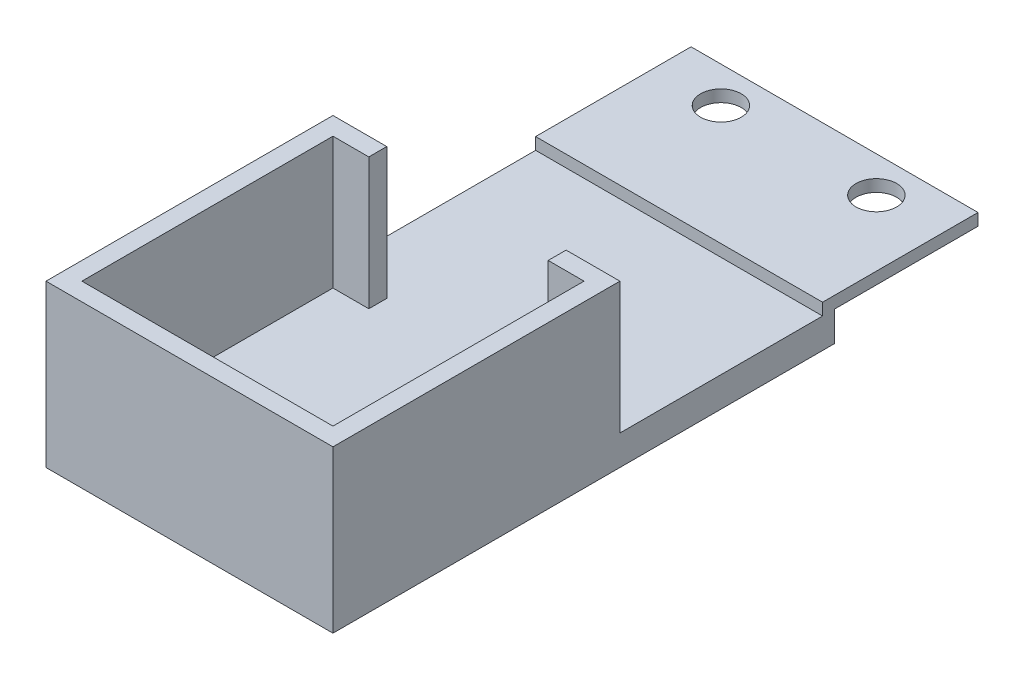
ISO-10303-21;
HEADER;
FILE_DESCRIPTION(('STEP AP214'),'2;1');
FILE_NAME('part.step','',(''),(''),'','','');
FILE_SCHEMA(('AUTOMOTIVE_DESIGN { 1 0 10303 214 1 1 1 1 }'));
ENDSEC;
DATA;
#1=APPLICATION_CONTEXT('core data for automotive mechanical design processes');
#2=APPLICATION_PROTOCOL_DEFINITION('international standard','automotive_design',2000,#1);
#3=PRODUCT_CONTEXT('',#1,'mechanical');
#4=PRODUCT('Part','Part','',(#3));
#5=PRODUCT_RELATED_PRODUCT_CATEGORY('part','',(#4));
#6=PRODUCT_DEFINITION_FORMATION('','',#4);
#7=PRODUCT_DEFINITION_CONTEXT('part definition',#1,'design');
#8=PRODUCT_DEFINITION('design','',#6,#7);
#9=PRODUCT_DEFINITION_SHAPE('','',#8);
#10=(LENGTH_UNIT() NAMED_UNIT(*) SI_UNIT(.MILLI.,.METRE.));
#11=(NAMED_UNIT(*) PLANE_ANGLE_UNIT() SI_UNIT($,.RADIAN.));
#12=(NAMED_UNIT(*) SI_UNIT($,.STERADIAN.) SOLID_ANGLE_UNIT());
#13=UNCERTAINTY_MEASURE_WITH_UNIT(LENGTH_MEASURE(1.E-05),#10,'distance_accuracy_value','');
#14=(GEOMETRIC_REPRESENTATION_CONTEXT(3) GLOBAL_UNCERTAINTY_ASSIGNED_CONTEXT((#13)) GLOBAL_UNIT_ASSIGNED_CONTEXT((#10,
#11,#12)) REPRESENTATION_CONTEXT('',''));
#15=CARTESIAN_POINT('',(0.,0.,0.));
#16=DIRECTION('',(0.,0.,1.));
#17=DIRECTION('',(1.,0.,0.));
#18=AXIS2_PLACEMENT_3D('',#15,#16,#17);
#19=CARTESIAN_POINT('',(0.,27.,35.9));
#20=DIRECTION('',(0.,0.,1.));
#21=DIRECTION('',(1.,0.,0.));
#22=AXIS2_PLACEMENT_3D('',#19,#20,#21);
#23=PLANE('',#22);
#24=DIRECTION('',(0.,1.,0.));
#25=VECTOR('',#24,1.);
#26=CARTESIAN_POINT('',(9.,27.,35.9));
#27=LINE('',#26,#25);
#28=CARTESIAN_POINT('',(9.,5.,35.9));
#29=VERTEX_POINT('',#28);
#30=CARTESIAN_POINT('',(9.,27.,35.9));
#31=VERTEX_POINT('',#30);
#32=EDGE_CURVE('E199',#29,#31,#27,.T.);
#33=ORIENTED_EDGE('',*,*,#32,.F.);
#34=DIRECTION('',(1.,0.,0.));
#35=VECTOR('',#34,1.);
#36=CARTESIAN_POINT('',(0.,5.,35.9));
#37=LINE('',#36,#35);
#38=CARTESIAN_POINT('',(0.,5.,35.9));
#39=VERTEX_POINT('',#38);
#40=EDGE_CURVE('E415',#39,#29,#37,.T.);
#41=ORIENTED_EDGE('',*,*,#40,.F.);
#42=DIRECTION('',(0.,-1.,0.));
#43=VECTOR('',#42,1.);
#44=CARTESIAN_POINT('',(0.,27.,35.9));
#45=LINE('',#44,#43);
#46=CARTESIAN_POINT('',(0.,27.,35.9));
#47=VERTEX_POINT('',#46);
#48=EDGE_CURVE('E206',#47,#39,#45,.T.);
#49=ORIENTED_EDGE('',*,*,#48,.F.);
#50=DIRECTION('',(-1.,0.,0.));
#51=VECTOR('',#50,1.);
#52=CARTESIAN_POINT('',(0.,27.,35.9));
#53=LINE('',#52,#51);
#54=EDGE_CURVE('E314',#31,#47,#53,.T.);
#55=ORIENTED_EDGE('',*,*,#54,.F.);
#56=EDGE_LOOP('',(#33,#41,#49,#55));
#57=FACE_BOUND('',#56,.T.);
#58=ADVANCED_FACE('F45',(#57),#23,.F.);
#59=CARTESIAN_POINT('',(3.,27.,38.9));
#60=DIRECTION('',(0.,0.,1.));
#61=DIRECTION('',(1.,0.,0.));
#62=AXIS2_PLACEMENT_3D('',#59,#60,#61);
#63=PLANE('',#62);
#64=DIRECTION('',(0.,-1.,0.));
#65=VECTOR('',#64,1.);
#66=CARTESIAN_POINT('',(9.,27.,38.9));
#67=LINE('',#66,#65);
#68=CARTESIAN_POINT('',(9.,27.,38.9));
#69=VERTEX_POINT('',#68);
#70=CARTESIAN_POINT('',(9.,5.,38.9));
#71=VERTEX_POINT('',#70);
#72=EDGE_CURVE('E385',#69,#71,#67,.T.);
#73=ORIENTED_EDGE('',*,*,#72,.F.);
#74=DIRECTION('',(-1.,0.,0.));
#75=VECTOR('',#74,1.);
#76=CARTESIAN_POINT('',(3.,27.,38.9));
#77=LINE('',#76,#75);
#78=CARTESIAN_POINT('',(3.,27.,38.9));
#79=VERTEX_POINT('',#78);
#80=EDGE_CURVE('E345',#69,#79,#77,.T.);
#81=ORIENTED_EDGE('',*,*,#80,.T.);
#82=DIRECTION('',(0.,-1.,0.));
#83=VECTOR('',#82,1.);
#84=CARTESIAN_POINT('',(3.,27.,38.9));
#85=LINE('',#84,#83);
#86=CARTESIAN_POINT('',(3.,5.,38.9));
#87=VERTEX_POINT('',#86);
#88=EDGE_CURVE('E344',#79,#87,#85,.T.);
#89=ORIENTED_EDGE('',*,*,#88,.T.);
#90=DIRECTION('',(-1.,0.,0.));
#91=VECTOR('',#90,1.);
#92=CARTESIAN_POINT('',(45.,5.,38.9));
#93=LINE('',#92,#91);
#94=EDGE_CURVE('E383',#71,#87,#93,.T.);
#95=ORIENTED_EDGE('',*,*,#94,.F.);
#96=EDGE_LOOP('',(#73,#81,#89,#95));
#97=FACE_BOUND('',#96,.T.);
#98=ADVANCED_FACE('F382',(#97),#63,.T.);
#99=CARTESIAN_POINT('',(48.,0.,0.));
#100=DIRECTION('',(0.,1.,0.));
#101=DIRECTION('',(0.,0.,1.));
#102=AXIS2_PLACEMENT_3D('',#99,#100,#101);
#103=PLANE('',#102);
#104=DIRECTION('',(0.,0.,-1.));
#105=VECTOR('',#104,1.);
#106=CARTESIAN_POINT('',(0.,0.,0.));
#107=LINE('',#106,#105);
#108=CARTESIAN_POINT('',(0.,0.,83.9));
#109=VERTEX_POINT('',#108);
#110=CARTESIAN_POINT('',(0.,0.,0.));
#111=VERTEX_POINT('',#110);
#112=EDGE_CURVE('E205',#109,#111,#107,.T.);
#113=ORIENTED_EDGE('',*,*,#112,.T.);
#114=DIRECTION('',(-1.,0.,0.));
#115=VECTOR('',#114,1.);
#116=CARTESIAN_POINT('',(48.,0.,0.));
#117=LINE('',#116,#115);
#118=CARTESIAN_POINT('',(48.,0.,0.));
#119=VERTEX_POINT('',#118);
#120=EDGE_CURVE('E11',#119,#111,#117,.T.);
#121=ORIENTED_EDGE('',*,*,#120,.F.);
#122=DIRECTION('',(0.,0.,-1.));
#123=VECTOR('',#122,1.);
#124=CARTESIAN_POINT('',(48.,0.,0.));
#125=LINE('',#124,#123);
#126=CARTESIAN_POINT('',(48.,0.,83.9));
#127=VERTEX_POINT('',#126);
#128=EDGE_CURVE('E217',#127,#119,#125,.T.);
#129=ORIENTED_EDGE('',*,*,#128,.F.);
#130=DIRECTION('',(-1.,0.,0.));
#131=VECTOR('',#130,1.);
#132=CARTESIAN_POINT('',(48.,0.,83.9));
#133=LINE('',#132,#131);
#134=EDGE_CURVE('E237',#127,#109,#133,.T.);
#135=ORIENTED_EDGE('',*,*,#134,.T.);
#136=EDGE_LOOP('',(#113,#121,#129,#135));
#137=FACE_BOUND('',#136,.T.);
#138=ADVANCED_FACE('F47',(#137),#103,.F.);
#139=CARTESIAN_POINT('',(48.,0.,0.));
#140=DIRECTION('',(0.,0.,1.));
#141=DIRECTION('',(1.,0.,0.));
#142=AXIS2_PLACEMENT_3D('',#139,#140,#141);
#143=PLANE('',#142);
#144=DIRECTION('',(0.,1.,0.));
#145=VECTOR('',#144,1.);
#146=CARTESIAN_POINT('',(0.,0.,0.));
#147=LINE('',#146,#145);
#148=CARTESIAN_POINT('',(0.,5.,0.));
#149=VERTEX_POINT('',#148);
#150=EDGE_CURVE('E211',#111,#149,#147,.T.);
#151=ORIENTED_EDGE('',*,*,#150,.T.);
#152=DIRECTION('',(-1.,0.,0.));
#153=VECTOR('',#152,1.);
#154=CARTESIAN_POINT('',(48.,5.,0.));
#155=LINE('',#154,#153);
#156=CARTESIAN_POINT('',(48.,5.,0.));
#157=VERTEX_POINT('',#156);
#158=EDGE_CURVE('E54',#157,#149,#155,.T.);
#159=ORIENTED_EDGE('',*,*,#158,.F.);
#160=DIRECTION('',(0.,1.,0.));
#161=VECTOR('',#160,1.);
#162=CARTESIAN_POINT('',(48.,0.,0.));
#163=LINE('',#162,#161);
#164=EDGE_CURVE('E220',#119,#157,#163,.T.);
#165=ORIENTED_EDGE('',*,*,#164,.F.);
#166=ORIENTED_EDGE('',*,*,#120,.T.);
#167=EDGE_LOOP('',(#151,#159,#165,#166));
#168=FACE_BOUND('',#167,.T.);
#169=ADVANCED_FACE('F295',(#168),#143,.F.);
#170=CARTESIAN_POINT('',(48.,5.,0.));
#171=DIRECTION('',(0.,1.,0.));
#172=DIRECTION('',(0.,0.,1.));
#173=AXIS2_PLACEMENT_3D('',#170,#171,#172);
#174=PLANE('',#173);
#175=CARTESIAN_POINT('',(11.,5.,-18.));
#176=DIRECTION('',(0.,1.,0.));
#177=DIRECTION('',(0.,0.,1.));
#178=AXIS2_PLACEMENT_3D('',#175,#176,#177);
#179=CIRCLE('',#178,3.4);
#180=CARTESIAN_POINT('',(11.,5.,-14.6));
#181=VERTEX_POINT('',#180);
#182=EDGE_CURVE('E406',#181,#181,#179,.T.);
#183=ORIENTED_EDGE('',*,*,#182,.T.);
#184=EDGE_LOOP('',(#183));
#185=FACE_BOUND('',#184,.T.);
#186=CARTESIAN_POINT('',(37.,5.,-18.));
#187=DIRECTION('',(0.,1.,0.));
#188=DIRECTION('',(0.,0.,1.));
#189=AXIS2_PLACEMENT_3D('',#186,#187,#188);
#190=CIRCLE('',#189,3.40000000000001);
#191=CARTESIAN_POINT('',(37.,5.,-14.6));
#192=VERTEX_POINT('',#191);
#193=EDGE_CURVE('E401',#192,#192,#190,.T.);
#194=ORIENTED_EDGE('',*,*,#193,.T.);
#195=EDGE_LOOP('',(#194));
#196=FACE_BOUND('',#195,.T.);
#197=DIRECTION('',(0.,0.,-1.));
#198=VECTOR('',#197,1.);
#199=CARTESIAN_POINT('',(0.,5.,0.));
#200=LINE('',#199,#198);
#201=CARTESIAN_POINT('',(0.,5.,-24.));
#202=VERTEX_POINT('',#201);
#203=EDGE_CURVE('E241',#149,#202,#200,.T.);
#204=ORIENTED_EDGE('',*,*,#203,.T.);
#205=DIRECTION('',(-1.,0.,0.));
#206=VECTOR('',#205,1.);
#207=CARTESIAN_POINT('',(48.,5.,-24.));
#208=LINE('',#207,#206);
#209=CARTESIAN_POINT('',(48.,5.,-24.));
#210=VERTEX_POINT('',#209);
#211=EDGE_CURVE('E267',#210,#202,#208,.T.);
#212=ORIENTED_EDGE('',*,*,#211,.F.);
#213=DIRECTION('',(0.,0.,-1.));
#214=VECTOR('',#213,1.);
#215=CARTESIAN_POINT('',(48.,5.,0.));
#216=LINE('',#215,#214);
#217=EDGE_CURVE('E224',#157,#210,#216,.T.);
#218=ORIENTED_EDGE('',*,*,#217,.F.);
#219=ORIENTED_EDGE('',*,*,#158,.T.);
#220=EDGE_LOOP('',(#204,#212,#218,#219));
#221=FACE_BOUND('',#220,.T.);
#222=ADVANCED_FACE('F276',(#185,#196,#221),#174,.F.);
#223=CARTESIAN_POINT('',(48.,7.,-24.));
#224=DIRECTION('',(0.,0.,1.));
#225=DIRECTION('',(1.,0.,0.));
#226=AXIS2_PLACEMENT_3D('',#223,#224,#225);
#227=PLANE('',#226);
#228=DIRECTION('',(0.,1.,0.));
#229=VECTOR('',#228,1.);
#230=CARTESIAN_POINT('',(0.,7.,-24.));
#231=LINE('',#230,#229);
#232=CARTESIAN_POINT('',(0.,7.,-24.));
#233=VERTEX_POINT('',#232);
#234=EDGE_CURVE('E244',#202,#233,#231,.T.);
#235=ORIENTED_EDGE('',*,*,#234,.T.);
#236=DIRECTION('',(-1.,0.,0.));
#237=VECTOR('',#236,1.);
#238=CARTESIAN_POINT('',(48.,7.,-24.));
#239=LINE('',#238,#237);
#240=CARTESIAN_POINT('',(48.,7.,-24.));
#241=VERTEX_POINT('',#240);
#242=EDGE_CURVE('E263',#241,#233,#239,.T.);
#243=ORIENTED_EDGE('',*,*,#242,.F.);
#244=DIRECTION('',(0.,1.,0.));
#245=VECTOR('',#244,1.);
#246=CARTESIAN_POINT('',(48.,7.,-24.));
#247=LINE('',#246,#245);
#248=EDGE_CURVE('E227',#210,#241,#247,.T.);
#249=ORIENTED_EDGE('',*,*,#248,.F.);
#250=ORIENTED_EDGE('',*,*,#211,.T.);
#251=EDGE_LOOP('',(#235,#243,#249,#250));
#252=FACE_BOUND('',#251,.T.);
#253=ADVANCED_FACE('F287',(#252),#227,.F.);
#254=CARTESIAN_POINT('',(48.,7.,2.));
#255=DIRECTION('',(0.,-1.,0.));
#256=DIRECTION('',(0.,0.,-1.));
#257=AXIS2_PLACEMENT_3D('',#254,#255,#256);
#258=PLANE('',#257);
#259=CARTESIAN_POINT('',(11.,7.,-18.));
#260=DIRECTION('',(0.,1.,0.));
#261=DIRECTION('',(0.,0.,1.));
#262=AXIS2_PLACEMENT_3D('',#259,#260,#261);
#263=CIRCLE('',#262,3.4);
#264=CARTESIAN_POINT('',(11.,7.,-14.6));
#265=VERTEX_POINT('',#264);
#266=EDGE_CURVE('E394',#265,#265,#263,.T.);
#267=ORIENTED_EDGE('',*,*,#266,.F.);
#268=EDGE_LOOP('',(#267));
#269=FACE_BOUND('',#268,.T.);
#270=CARTESIAN_POINT('',(37.,7.,-18.));
#271=DIRECTION('',(0.,1.,0.));
#272=DIRECTION('',(0.,0.,-1.));
#273=AXIS2_PLACEMENT_3D('',#270,#271,#272);
#274=CIRCLE('',#273,3.40000000000001);
#275=CARTESIAN_POINT('',(37.,7.,-21.4));
#276=VERTEX_POINT('',#275);
#277=EDGE_CURVE('E389',#276,#276,#274,.T.);
#278=ORIENTED_EDGE('',*,*,#277,.F.);
#279=EDGE_LOOP('',(#278));
#280=FACE_BOUND('',#279,.T.);
#281=DIRECTION('',(0.,0.,1.));
#282=VECTOR('',#281,1.);
#283=CARTESIAN_POINT('',(0.,7.,2.));
#284=LINE('',#283,#282);
#285=CARTESIAN_POINT('',(0.,7.,2.));
#286=VERTEX_POINT('',#285);
#287=EDGE_CURVE('E247',#233,#286,#284,.T.);
#288=ORIENTED_EDGE('',*,*,#287,.T.);
#289=DIRECTION('',(-1.,0.,0.));
#290=VECTOR('',#289,1.);
#291=CARTESIAN_POINT('',(48.,7.,2.));
#292=LINE('',#291,#290);
#293=CARTESIAN_POINT('',(48.,7.,2.));
#294=VERTEX_POINT('',#293);
#295=EDGE_CURVE('E259',#294,#286,#292,.T.);
#296=ORIENTED_EDGE('',*,*,#295,.F.);
#297=DIRECTION('',(0.,0.,1.));
#298=VECTOR('',#297,1.);
#299=CARTESIAN_POINT('',(48.,7.,2.));
#300=LINE('',#299,#298);
#301=EDGE_CURVE('E230',#241,#294,#300,.T.);
#302=ORIENTED_EDGE('',*,*,#301,.F.);
#303=ORIENTED_EDGE('',*,*,#242,.T.);
#304=EDGE_LOOP('',(#288,#296,#302,#303));
#305=FACE_BOUND('',#304,.T.);
#306=ADVANCED_FACE('F291',(#269,#280,#305),#258,.F.);
#307=CARTESIAN_POINT('',(48.,2.,2.));
#308=DIRECTION('',(0.,0.,-1.));
#309=DIRECTION('',(-1.,0.,0.));
#310=AXIS2_PLACEMENT_3D('',#307,#308,#309);
#311=PLANE('',#310);
#312=DIRECTION('',(0.,-1.,0.));
#313=VECTOR('',#312,1.);
#314=CARTESIAN_POINT('',(0.,2.,2.));
#315=LINE('',#314,#313);
#316=CARTESIAN_POINT('',(0.,5.,2.));
#317=VERTEX_POINT('',#316);
#318=EDGE_CURVE('E250',#286,#317,#315,.T.);
#319=ORIENTED_EDGE('',*,*,#318,.T.);
#320=DIRECTION('',(-1.,0.,0.));
#321=VECTOR('',#320,1.);
#322=CARTESIAN_POINT('',(48.,5.,2.));
#323=LINE('',#322,#321);
#324=CARTESIAN_POINT('',(48.,5.00000000000001,2.));
#325=VERTEX_POINT('',#324);
#326=EDGE_CURVE('E188',#325,#317,#323,.T.);
#327=ORIENTED_EDGE('',*,*,#326,.F.);
#328=DIRECTION('',(0.,-1.,0.));
#329=VECTOR('',#328,1.);
#330=CARTESIAN_POINT('',(48.,2.,2.));
#331=LINE('',#330,#329);
#332=EDGE_CURVE('E183',#294,#325,#331,.T.);
#333=ORIENTED_EDGE('',*,*,#332,.F.);
#334=ORIENTED_EDGE('',*,*,#295,.T.);
#335=EDGE_LOOP('',(#319,#327,#333,#334));
#336=FACE_BOUND('',#335,.T.);
#337=ADVANCED_FACE('F436',(#336),#311,.F.);
#338=CARTESIAN_POINT('',(48.,1.99999999999999,83.9));
#339=DIRECTION('',(0.,0.,-1.));
#340=DIRECTION('',(-1.,0.,0.));
#341=AXIS2_PLACEMENT_3D('',#338,#339,#340);
#342=PLANE('',#341);
#343=DIRECTION('',(0.,-1.,0.));
#344=VECTOR('',#343,1.);
#345=CARTESIAN_POINT('',(0.,1.99999999999999,83.9));
#346=LINE('',#345,#344);
#347=CARTESIAN_POINT('',(0.,27.,83.9));
#348=VERTEX_POINT('',#347);
#349=EDGE_CURVE('E221',#348,#109,#346,.T.);
#350=ORIENTED_EDGE('',*,*,#349,.T.);
#351=ORIENTED_EDGE('',*,*,#134,.F.);
#352=DIRECTION('',(0.,-1.,0.));
#353=VECTOR('',#352,1.);
#354=CARTESIAN_POINT('',(48.,1.99999999999999,83.9));
#355=LINE('',#354,#353);
#356=CARTESIAN_POINT('',(48.,27.,83.9));
#357=VERTEX_POINT('',#356);
#358=EDGE_CURVE('E235',#357,#127,#355,.T.);
#359=ORIENTED_EDGE('',*,*,#358,.F.);
#360=DIRECTION('',(1.,0.,0.));
#361=VECTOR('',#360,1.);
#362=CARTESIAN_POINT('',(0.,27.,83.9));
#363=LINE('',#362,#361);
#364=EDGE_CURVE('E304',#348,#357,#363,.T.);
#365=ORIENTED_EDGE('',*,*,#364,.F.);
#366=EDGE_LOOP('',(#350,#351,#359,#365));
#367=FACE_BOUND('',#366,.T.);
#368=ADVANCED_FACE('F305',(#367),#342,.F.);
#369=CARTESIAN_POINT('',(48.,0.,0.));
#370=DIRECTION('',(1.,0.,0.));
#371=DIRECTION('',(0.,0.,-1.));
#372=AXIS2_PLACEMENT_3D('',#369,#370,#371);
#373=PLANE('',#372);
#374=ORIENTED_EDGE('',*,*,#128,.T.);
#375=ORIENTED_EDGE('',*,*,#164,.T.);
#376=ORIENTED_EDGE('',*,*,#217,.T.);
#377=ORIENTED_EDGE('',*,*,#248,.T.);
#378=ORIENTED_EDGE('',*,*,#301,.T.);
#379=ORIENTED_EDGE('',*,*,#332,.T.);
#380=DIRECTION('',(0.,0.,-1.));
#381=VECTOR('',#380,1.);
#382=CARTESIAN_POINT('',(48.,5.,35.9));
#383=LINE('',#382,#381);
#384=CARTESIAN_POINT('',(48.,5.,35.9));
#385=VERTEX_POINT('',#384);
#386=EDGE_CURVE('E174',#385,#325,#383,.T.);
#387=ORIENTED_EDGE('',*,*,#386,.F.);
#388=DIRECTION('',(0.,-1.,0.));
#389=VECTOR('',#388,1.);
#390=CARTESIAN_POINT('',(48.,27.,35.9));
#391=LINE('',#390,#389);
#392=CARTESIAN_POINT('',(48.,27.,35.9));
#393=VERTEX_POINT('',#392);
#394=EDGE_CURVE('E180',#393,#385,#391,.T.);
#395=ORIENTED_EDGE('',*,*,#394,.F.);
#396=DIRECTION('',(0.,0.,-1.));
#397=VECTOR('',#396,1.);
#398=CARTESIAN_POINT('',(48.,27.,83.9));
#399=LINE('',#398,#397);
#400=EDGE_CURVE('E308',#357,#393,#399,.T.);
#401=ORIENTED_EDGE('',*,*,#400,.F.);
#402=ORIENTED_EDGE('',*,*,#358,.T.);
#403=EDGE_LOOP('',(#374,#375,#376,#377,#378,#379,#387,#395,#401,#402));
#404=FACE_BOUND('',#403,.T.);
#405=ADVANCED_FACE('F177',(#404),#373,.T.);
#406=CARTESIAN_POINT('',(0.,0.,0.));
#407=DIRECTION('',(1.,0.,0.));
#408=DIRECTION('',(0.,0.,-1.));
#409=AXIS2_PLACEMENT_3D('',#406,#407,#408);
#410=PLANE('',#409);
#411=ORIENTED_EDGE('',*,*,#112,.F.);
#412=ORIENTED_EDGE('',*,*,#349,.F.);
#413=DIRECTION('',(0.,0.,1.));
#414=VECTOR('',#413,1.);
#415=CARTESIAN_POINT('',(0.,27.,83.9));
#416=LINE('',#415,#414);
#417=EDGE_CURVE('E301',#47,#348,#416,.T.);
#418=ORIENTED_EDGE('',*,*,#417,.F.);
#419=ORIENTED_EDGE('',*,*,#48,.T.);
#420=DIRECTION('',(0.,0.,1.));
#421=VECTOR('',#420,1.);
#422=CARTESIAN_POINT('',(0.,5.,2.));
#423=LINE('',#422,#421);
#424=EDGE_CURVE('E422',#317,#39,#423,.T.);
#425=ORIENTED_EDGE('',*,*,#424,.F.);
#426=ORIENTED_EDGE('',*,*,#318,.F.);
#427=ORIENTED_EDGE('',*,*,#287,.F.);
#428=ORIENTED_EDGE('',*,*,#234,.F.);
#429=ORIENTED_EDGE('',*,*,#203,.F.);
#430=ORIENTED_EDGE('',*,*,#150,.F.);
#431=EDGE_LOOP('',(#411,#412,#418,#419,#425,#426,#427,#428,#429,#430));
#432=FACE_BOUND('',#431,.T.);
#433=ADVANCED_FACE('F282',(#432),#410,.F.);
#434=CARTESIAN_POINT('',(0.,27.,0.));
#435=DIRECTION('',(0.,-1.,0.));
#436=DIRECTION('',(0.,0.,-1.));
#437=AXIS2_PLACEMENT_3D('',#434,#435,#436);
#438=PLANE('',#437);
#439=ORIENTED_EDGE('',*,*,#80,.F.);
#440=DIRECTION('',(0.,0.,-1.));
#441=VECTOR('',#440,1.);
#442=CARTESIAN_POINT('',(9.,27.,45.9));
#443=LINE('',#442,#441);
#444=EDGE_CURVE('E336',#69,#31,#443,.T.);
#445=ORIENTED_EDGE('',*,*,#444,.T.);
#446=ORIENTED_EDGE('',*,*,#54,.T.);
#447=ORIENTED_EDGE('',*,*,#417,.T.);
#448=ORIENTED_EDGE('',*,*,#364,.T.);
#449=ORIENTED_EDGE('',*,*,#400,.T.);
#450=CARTESIAN_POINT('',(39.,27.,35.9));
#451=VERTEX_POINT('',#450);
#452=EDGE_CURVE('E203',#393,#451,#53,.T.);
#453=ORIENTED_EDGE('',*,*,#452,.T.);
#454=DIRECTION('',(0.,0.,-1.));
#455=VECTOR('',#454,1.);
#456=CARTESIAN_POINT('',(39.,27.,45.9));
#457=LINE('',#456,#455);
#458=CARTESIAN_POINT('',(39.,27.,38.9));
#459=VERTEX_POINT('',#458);
#460=EDGE_CURVE('E329',#459,#451,#457,.T.);
#461=ORIENTED_EDGE('',*,*,#460,.F.);
#462=CARTESIAN_POINT('',(45.,27.,38.9));
#463=VERTEX_POINT('',#462);
#464=EDGE_CURVE('E332',#463,#459,#77,.T.);
#465=ORIENTED_EDGE('',*,*,#464,.F.);
#466=DIRECTION('',(0.,0.,-1.));
#467=VECTOR('',#466,1.);
#468=CARTESIAN_POINT('',(45.,27.,80.9));
#469=LINE('',#468,#467);
#470=CARTESIAN_POINT('',(45.,27.,80.9));
#471=VERTEX_POINT('',#470);
#472=EDGE_CURVE('E351',#471,#463,#469,.T.);
#473=ORIENTED_EDGE('',*,*,#472,.F.);
#474=DIRECTION('',(1.,0.,0.));
#475=VECTOR('',#474,1.);
#476=CARTESIAN_POINT('',(3.,27.,80.9));
#477=LINE('',#476,#475);
#478=CARTESIAN_POINT('',(3.,27.,80.9));
#479=VERTEX_POINT('',#478);
#480=EDGE_CURVE('E359',#479,#471,#477,.T.);
#481=ORIENTED_EDGE('',*,*,#480,.F.);
#482=DIRECTION('',(0.,0.,1.));
#483=VECTOR('',#482,1.);
#484=CARTESIAN_POINT('',(3.,27.,80.9));
#485=LINE('',#484,#483);
#486=EDGE_CURVE('E364',#79,#479,#485,.T.);
#487=ORIENTED_EDGE('',*,*,#486,.F.);
#488=EDGE_LOOP('',(#439,#445,#446,#447,#448,#449,#453,#461,#465,#473,#481,#487));
#489=FACE_BOUND('',#488,.T.);
#490=ADVANCED_FACE('F311',(#489),#438,.F.);
#491=ORIENTED_EDGE('',*,*,#394,.T.);
#492=DIRECTION('',(1.,0.,0.));
#493=VECTOR('',#492,1.);
#494=CARTESIAN_POINT('',(39.,5.,35.9));
#495=LINE('',#494,#493);
#496=CARTESIAN_POINT('',(39.,5.,35.9));
#497=VERTEX_POINT('',#496);
#498=EDGE_CURVE('E191',#497,#385,#495,.T.);
#499=ORIENTED_EDGE('',*,*,#498,.F.);
#500=DIRECTION('',(0.,-1.,0.));
#501=VECTOR('',#500,1.);
#502=CARTESIAN_POINT('',(39.,27.,35.9));
#503=LINE('',#502,#501);
#504=EDGE_CURVE('E431',#451,#497,#503,.T.);
#505=ORIENTED_EDGE('',*,*,#504,.F.);
#506=ORIENTED_EDGE('',*,*,#452,.F.);
#507=EDGE_LOOP('',(#491,#499,#505,#506));
#508=FACE_BOUND('',#507,.T.);
#509=ADVANCED_FACE('F201',(#508),#23,.F.);
#510=CARTESIAN_POINT('',(3.,27.,80.9));
#511=DIRECTION('',(1.,0.,0.));
#512=DIRECTION('',(0.,0.,-1.));
#513=AXIS2_PLACEMENT_3D('',#510,#511,#512);
#514=PLANE('',#513);
#515=DIRECTION('',(0.,0.,1.));
#516=VECTOR('',#515,1.);
#517=CARTESIAN_POINT('',(3.,5.,38.9));
#518=LINE('',#517,#516);
#519=CARTESIAN_POINT('',(3.,4.99999999999999,80.9));
#520=VERTEX_POINT('',#519);
#521=EDGE_CURVE('E362',#87,#520,#518,.T.);
#522=ORIENTED_EDGE('',*,*,#521,.F.);
#523=ORIENTED_EDGE('',*,*,#88,.F.);
#524=ORIENTED_EDGE('',*,*,#486,.T.);
#525=DIRECTION('',(0.,-1.,0.));
#526=VECTOR('',#525,1.);
#527=CARTESIAN_POINT('',(3.,27.,80.9));
#528=LINE('',#527,#526);
#529=EDGE_CURVE('E317',#479,#520,#528,.T.);
#530=ORIENTED_EDGE('',*,*,#529,.T.);
#531=EDGE_LOOP('',(#522,#523,#524,#530));
#532=FACE_BOUND('',#531,.T.);
#533=ADVANCED_FACE('F378',(#532),#514,.T.);
#534=CARTESIAN_POINT('',(3.,27.,80.9));
#535=DIRECTION('',(0.,0.,-1.));
#536=DIRECTION('',(-1.,0.,0.));
#537=AXIS2_PLACEMENT_3D('',#534,#535,#536);
#538=PLANE('',#537);
#539=DIRECTION('',(1.,0.,0.));
#540=VECTOR('',#539,1.);
#541=CARTESIAN_POINT('',(3.,4.99999999999999,80.9));
#542=LINE('',#541,#540);
#543=CARTESIAN_POINT('',(45.,4.99999999999999,80.9));
#544=VERTEX_POINT('',#543);
#545=EDGE_CURVE('E61',#520,#544,#542,.T.);
#546=ORIENTED_EDGE('',*,*,#545,.F.);
#547=ORIENTED_EDGE('',*,*,#529,.F.);
#548=ORIENTED_EDGE('',*,*,#480,.T.);
#549=DIRECTION('',(0.,-1.,0.));
#550=VECTOR('',#549,1.);
#551=CARTESIAN_POINT('',(45.,27.,80.9));
#552=LINE('',#551,#550);
#553=EDGE_CURVE('E320',#471,#544,#552,.T.);
#554=ORIENTED_EDGE('',*,*,#553,.T.);
#555=EDGE_LOOP('',(#546,#547,#548,#554));
#556=FACE_BOUND('',#555,.T.);
#557=ADVANCED_FACE('F357',(#556),#538,.T.);
#558=CARTESIAN_POINT('',(45.,27.,80.9));
#559=DIRECTION('',(-1.,0.,0.));
#560=DIRECTION('',(0.,0.,1.));
#561=AXIS2_PLACEMENT_3D('',#558,#559,#560);
#562=PLANE('',#561);
#563=DIRECTION('',(0.,0.,-1.));
#564=VECTOR('',#563,1.);
#565=CARTESIAN_POINT('',(45.,4.99999999999999,80.9));
#566=LINE('',#565,#564);
#567=CARTESIAN_POINT('',(45.,5.,38.9));
#568=VERTEX_POINT('',#567);
#569=EDGE_CURVE('E69',#544,#568,#566,.T.);
#570=ORIENTED_EDGE('',*,*,#569,.F.);
#571=ORIENTED_EDGE('',*,*,#553,.F.);
#572=ORIENTED_EDGE('',*,*,#472,.T.);
#573=DIRECTION('',(0.,-1.,0.));
#574=VECTOR('',#573,1.);
#575=CARTESIAN_POINT('',(45.,27.,38.9));
#576=LINE('',#575,#574);
#577=EDGE_CURVE('E341',#463,#568,#576,.T.);
#578=ORIENTED_EDGE('',*,*,#577,.T.);
#579=EDGE_LOOP('',(#570,#571,#572,#578));
#580=FACE_BOUND('',#579,.T.);
#581=ADVANCED_FACE('F374',(#580),#562,.T.);
#582=DIRECTION('',(0.,1.,0.));
#583=VECTOR('',#582,1.);
#584=CARTESIAN_POINT('',(39.,27.,38.9));
#585=LINE('',#584,#583);
#586=CARTESIAN_POINT('',(39.,5.00000000000001,38.9));
#587=VERTEX_POINT('',#586);
#588=EDGE_CURVE('E335',#587,#459,#585,.T.);
#589=ORIENTED_EDGE('',*,*,#588,.F.);
#590=EDGE_CURVE('E369',#568,#587,#93,.T.);
#591=ORIENTED_EDGE('',*,*,#590,.F.);
#592=ORIENTED_EDGE('',*,*,#577,.F.);
#593=ORIENTED_EDGE('',*,*,#464,.T.);
#594=EDGE_LOOP('',(#589,#591,#592,#593));
#595=FACE_BOUND('',#594,.T.);
#596=ADVANCED_FACE('F340',(#595),#63,.T.);
#597=CARTESIAN_POINT('',(0.,5.,0.));
#598=DIRECTION('',(0.,1.,0.));
#599=DIRECTION('',(0.,0.,1.));
#600=AXIS2_PLACEMENT_3D('',#597,#598,#599);
#601=PLANE('',#600);
#602=ORIENTED_EDGE('',*,*,#590,.T.);
#603=DIRECTION('',(0.,0.,-1.));
#604=VECTOR('',#603,1.);
#605=CARTESIAN_POINT('',(39.,5.,45.9));
#606=LINE('',#605,#604);
#607=EDGE_CURVE('E194',#587,#497,#606,.T.);
#608=ORIENTED_EDGE('',*,*,#607,.T.);
#609=ORIENTED_EDGE('',*,*,#498,.T.);
#610=ORIENTED_EDGE('',*,*,#386,.T.);
#611=ORIENTED_EDGE('',*,*,#326,.T.);
#612=ORIENTED_EDGE('',*,*,#424,.T.);
#613=ORIENTED_EDGE('',*,*,#40,.T.);
#614=DIRECTION('',(0.,0.,1.));
#615=VECTOR('',#614,1.);
#616=CARTESIAN_POINT('',(9.,5.,35.9));
#617=LINE('',#616,#615);
#618=EDGE_CURVE('E413',#29,#71,#617,.T.);
#619=ORIENTED_EDGE('',*,*,#618,.T.);
#620=ORIENTED_EDGE('',*,*,#94,.T.);
#621=ORIENTED_EDGE('',*,*,#521,.T.);
#622=ORIENTED_EDGE('',*,*,#545,.T.);
#623=ORIENTED_EDGE('',*,*,#569,.T.);
#624=EDGE_LOOP('',(#602,#608,#609,#610,#611,#612,#613,#619,#620,#621,#622,#623));
#625=FACE_BOUND('',#624,.T.);
#626=ADVANCED_FACE('F193',(#625),#601,.T.);
#627=CARTESIAN_POINT('',(37.,0.,-18.));
#628=DIRECTION('',(0.,1.,0.));
#629=DIRECTION('',(0.,0.,1.));
#630=AXIS2_PLACEMENT_3D('',#627,#628,#629);
#631=CYLINDRICAL_SURFACE('',#630,3.40000000000001);
#632=ORIENTED_EDGE('',*,*,#277,.T.);
#633=EDGE_LOOP('',(#632));
#634=FACE_BOUND('',#633,.T.);
#635=ORIENTED_EDGE('',*,*,#193,.F.);
#636=EDGE_LOOP('',(#635));
#637=FACE_BOUND('',#636,.T.);
#638=ADVANCED_FACE('F474',(#634,#637),#631,.F.);
#639=CARTESIAN_POINT('',(11.,0.,-18.));
#640=DIRECTION('',(0.,1.,0.));
#641=DIRECTION('',(0.,0.,1.));
#642=AXIS2_PLACEMENT_3D('',#639,#640,#641);
#643=CYLINDRICAL_SURFACE('',#642,3.4);
#644=ORIENTED_EDGE('',*,*,#266,.T.);
#645=EDGE_LOOP('',(#644));
#646=FACE_BOUND('',#645,.T.);
#647=ORIENTED_EDGE('',*,*,#182,.F.);
#648=EDGE_LOOP('',(#647));
#649=FACE_BOUND('',#648,.T.);
#650=ADVANCED_FACE('F477',(#646,#649),#643,.F.);
#651=CARTESIAN_POINT('',(9.,27.,45.9));
#652=DIRECTION('',(-1.,0.,0.));
#653=DIRECTION('',(0.,0.,1.));
#654=AXIS2_PLACEMENT_3D('',#651,#652,#653);
#655=PLANE('',#654);
#656=ORIENTED_EDGE('',*,*,#72,.T.);
#657=ORIENTED_EDGE('',*,*,#618,.F.);
#658=ORIENTED_EDGE('',*,*,#32,.T.);
#659=ORIENTED_EDGE('',*,*,#444,.F.);
#660=EDGE_LOOP('',(#656,#657,#658,#659));
#661=FACE_BOUND('',#660,.T.);
#662=ADVANCED_FACE('F480',(#661),#655,.F.);
#663=CARTESIAN_POINT('',(39.,27.,45.9));
#664=DIRECTION('',(1.,0.,0.));
#665=DIRECTION('',(0.,0.,-1.));
#666=AXIS2_PLACEMENT_3D('',#663,#664,#665);
#667=PLANE('',#666);
#668=ORIENTED_EDGE('',*,*,#504,.T.);
#669=ORIENTED_EDGE('',*,*,#607,.F.);
#670=ORIENTED_EDGE('',*,*,#588,.T.);
#671=ORIENTED_EDGE('',*,*,#460,.T.);
#672=EDGE_LOOP('',(#668,#669,#670,#671));
#673=FACE_BOUND('',#672,.T.);
#674=ADVANCED_FACE('F484',(#673),#667,.F.);
#675=CLOSED_SHELL('',(#58,#98,#138,#169,#222,#253,#306,#337,#368,#405,#433,#490,#509,#533,#557,
#581,#596,#626,#638,#650,#662,#674));
#676=MANIFOLD_SOLID_BREP('B2',#675);
#677=ADVANCED_BREP_SHAPE_REPRESENTATION('',(#18,#676),#14);
#678=SHAPE_DEFINITION_REPRESENTATION(#9,#677);
ENDSEC;
END-ISO-10303-21;
